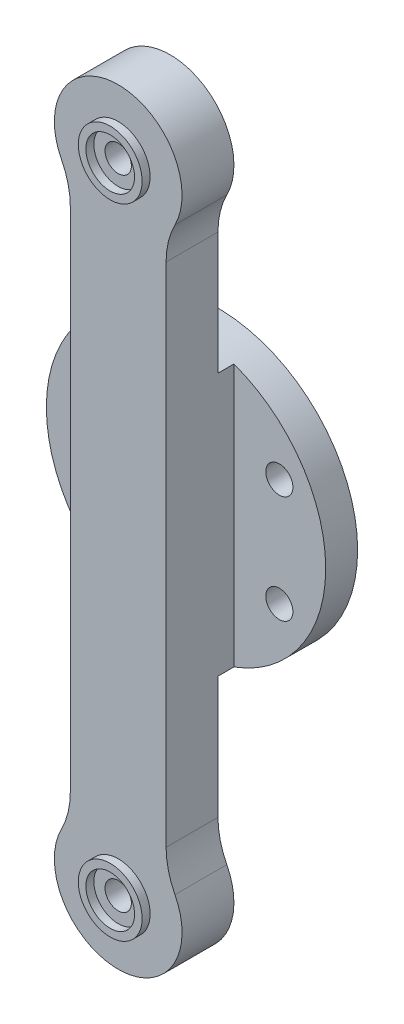
ISO-10303-21;
HEADER;
FILE_DESCRIPTION(('STEP AP214'),'2;1');
FILE_NAME('part.step','',(''),(''),'','','');
FILE_SCHEMA(('AUTOMOTIVE_DESIGN { 1 0 10303 214 1 1 1 1 }'));
ENDSEC;
DATA;
#1=APPLICATION_CONTEXT('core data for automotive mechanical design processes');
#2=APPLICATION_PROTOCOL_DEFINITION('international standard','automotive_design',2000,#1);
#3=PRODUCT_CONTEXT('',#1,'mechanical');
#4=PRODUCT('Part','Part','',(#3));
#5=PRODUCT_RELATED_PRODUCT_CATEGORY('part','',(#4));
#6=PRODUCT_DEFINITION_FORMATION('','',#4);
#7=PRODUCT_DEFINITION_CONTEXT('part definition',#1,'design');
#8=PRODUCT_DEFINITION('design','',#6,#7);
#9=PRODUCT_DEFINITION_SHAPE('','',#8);
#10=(LENGTH_UNIT() NAMED_UNIT(*) SI_UNIT(.MILLI.,.METRE.));
#11=(NAMED_UNIT(*) PLANE_ANGLE_UNIT() SI_UNIT($,.RADIAN.));
#12=(NAMED_UNIT(*) SI_UNIT($,.STERADIAN.) SOLID_ANGLE_UNIT());
#13=UNCERTAINTY_MEASURE_WITH_UNIT(LENGTH_MEASURE(1.E-05),#10,'distance_accuracy_value','');
#14=(GEOMETRIC_REPRESENTATION_CONTEXT(3) GLOBAL_UNCERTAINTY_ASSIGNED_CONTEXT((#13)) GLOBAL_UNIT_ASSIGNED_CONTEXT((#10,
#11,#12)) REPRESENTATION_CONTEXT('',''));
#15=CARTESIAN_POINT('',(0.,0.,0.));
#16=DIRECTION('',(0.,0.,1.));
#17=DIRECTION('',(1.,0.,0.));
#18=AXIS2_PLACEMENT_3D('',#15,#16,#17);
#19=CARTESIAN_POINT('',(0.,0.,0.));
#20=DIRECTION('',(0.,0.,1.));
#21=DIRECTION('',(1.,0.,0.));
#22=AXIS2_PLACEMENT_3D('',#19,#20,#21);
#23=PLANE('',#22);
#24=CARTESIAN_POINT('',(11.6913429510888,-6.75000000000067,0.));
#25=DIRECTION('',(0.,0.,1.));
#26=DIRECTION('',(1.,0.,0.));
#27=AXIS2_PLACEMENT_3D('',#24,#25,#26);
#28=CIRCLE('',#27,1.70000000000019);
#29=CARTESIAN_POINT('',(13.391342951089,-6.75000000000067,0.));
#30=VERTEX_POINT('',#29);
#31=EDGE_CURVE('E311',#30,#30,#28,.T.);
#32=ORIENTED_EDGE('',*,*,#31,.F.);
#33=EDGE_LOOP('',(#32));
#34=FACE_BOUND('',#33,.T.);
#35=CARTESIAN_POINT('',(11.6913429510895,6.74999999999933,0.));
#36=DIRECTION('',(0.,0.,1.));
#37=DIRECTION('',(1.,0.,0.));
#38=AXIS2_PLACEMENT_3D('',#35,#36,#37);
#39=CIRCLE('',#38,1.70000000000019);
#40=CARTESIAN_POINT('',(13.3913429510897,6.74999999999933,0.));
#41=VERTEX_POINT('',#40);
#42=EDGE_CURVE('E322',#41,#41,#39,.T.);
#43=ORIENTED_EDGE('',*,*,#42,.F.);
#44=EDGE_LOOP('',(#43));
#45=FACE_BOUND('',#44,.T.);
#46=DIRECTION('',(0.,1.,0.));
#47=VECTOR('',#46,1.);
#48=CARTESIAN_POINT('',(6.,16.4392822227736,0.));
#49=LINE('',#48,#47);
#50=CARTESIAN_POINT('',(6.,-16.4392822227736,0.));
#51=VERTEX_POINT('',#50);
#52=CARTESIAN_POINT('',(6.,16.4392822227736,0.));
#53=VERTEX_POINT('',#52);
#54=EDGE_CURVE('E162',#51,#53,#49,.T.);
#55=ORIENTED_EDGE('',*,*,#54,.F.);
#56=CARTESIAN_POINT('',(0.,0.,0.));
#57=DIRECTION('',(0.,0.,1.));
#58=DIRECTION('',(1.,0.,0.));
#59=AXIS2_PLACEMENT_3D('',#56,#57,#58);
#60=CIRCLE('',#59,17.5);
#61=EDGE_CURVE('E151',#51,#53,#60,.T.);
#62=ORIENTED_EDGE('',*,*,#61,.T.);
#63=EDGE_LOOP('',(#55,#62));
#64=FACE_BOUND('',#63,.T.);
#65=ADVANCED_FACE('F41',(#34,#45,#64),#23,.T.);
#66=CARTESIAN_POINT('',(0.,0.,-4.));
#67=DIRECTION('',(0.,0.,1.));
#68=DIRECTION('',(1.,0.,0.));
#69=AXIS2_PLACEMENT_3D('',#66,#67,#68);
#70=CYLINDRICAL_SURFACE('',#69,17.5);
#71=CARTESIAN_POINT('',(0.,0.,-4.));
#72=DIRECTION('',(0.,0.,1.));
#73=DIRECTION('',(1.,0.,0.));
#74=AXIS2_PLACEMENT_3D('',#71,#72,#73);
#75=CIRCLE('',#74,17.5);
#76=CARTESIAN_POINT('',(17.5,0.,-4.));
#77=VERTEX_POINT('',#76);
#78=EDGE_CURVE('E177',#77,#77,#75,.T.);
#79=ORIENTED_EDGE('',*,*,#78,.T.);
#80=EDGE_LOOP('',(#79));
#81=FACE_BOUND('',#80,.T.);
#82=CARTESIAN_POINT('',(-6.,16.4392822227736,0.));
#83=VERTEX_POINT('',#82);
#84=CARTESIAN_POINT('',(-6.,-16.4392822227736,0.));
#85=VERTEX_POINT('',#84);
#86=EDGE_CURVE('E176',#83,#85,#60,.T.);
#87=ORIENTED_EDGE('',*,*,#86,.F.);
#88=DIRECTION('',(0.,0.,-1.));
#89=VECTOR('',#88,1.);
#90=CARTESIAN_POINT('',(-6.,16.4392822227736,2.));
#91=LINE('',#90,#89);
#92=CARTESIAN_POINT('',(-6.,16.4392822227736,2.));
#93=VERTEX_POINT('',#92);
#94=EDGE_CURVE('E172',#93,#83,#91,.T.);
#95=ORIENTED_EDGE('',*,*,#94,.F.);
#96=CARTESIAN_POINT('',(0.,0.,2.));
#97=DIRECTION('',(0.,0.,1.));
#98=DIRECTION('',(-1.,0.,0.));
#99=AXIS2_PLACEMENT_3D('',#96,#97,#98);
#100=CIRCLE('',#99,17.5);
#101=CARTESIAN_POINT('',(6.,16.4392822227736,2.));
#102=VERTEX_POINT('',#101);
#103=EDGE_CURVE('E158',#102,#93,#100,.T.);
#104=ORIENTED_EDGE('',*,*,#103,.F.);
#105=DIRECTION('',(0.,0.,-1.));
#106=VECTOR('',#105,1.);
#107=CARTESIAN_POINT('',(6.,16.4392822227736,2.));
#108=LINE('',#107,#106);
#109=EDGE_CURVE('E153',#102,#53,#108,.T.);
#110=ORIENTED_EDGE('',*,*,#109,.T.);
#111=ORIENTED_EDGE('',*,*,#61,.F.);
#112=DIRECTION('',(0.,0.,-1.));
#113=VECTOR('',#112,1.);
#114=CARTESIAN_POINT('',(6.,-16.4392822227736,2.));
#115=LINE('',#114,#113);
#116=CARTESIAN_POINT('',(6.,-16.4392822227736,2.));
#117=VERTEX_POINT('',#116);
#118=EDGE_CURVE('E135',#117,#51,#115,.T.);
#119=ORIENTED_EDGE('',*,*,#118,.F.);
#120=CARTESIAN_POINT('',(0.,0.,2.));
#121=DIRECTION('',(0.,0.,1.));
#122=DIRECTION('',(-1.,0.,0.));
#123=AXIS2_PLACEMENT_3D('',#120,#121,#122);
#124=CIRCLE('',#123,17.5);
#125=CARTESIAN_POINT('',(-6.,-16.4392822227736,2.));
#126=VERTEX_POINT('',#125);
#127=EDGE_CURVE('E148',#126,#117,#124,.T.);
#128=ORIENTED_EDGE('',*,*,#127,.F.);
#129=DIRECTION('',(0.,0.,-1.));
#130=VECTOR('',#129,1.);
#131=CARTESIAN_POINT('',(-6.,-16.4392822227736,2.));
#132=LINE('',#131,#130);
#133=EDGE_CURVE('E152',#126,#85,#132,.T.);
#134=ORIENTED_EDGE('',*,*,#133,.T.);
#135=EDGE_LOOP('',(#87,#95,#104,#110,#111,#119,#128,#134));
#136=FACE_BOUND('',#135,.T.);
#137=ADVANCED_FACE('F146',(#81,#136),#70,.T.);
#138=CARTESIAN_POINT('',(17.5,0.,-4.));
#139=DIRECTION('',(0.,0.,-1.));
#140=DIRECTION('',(-1.,0.,0.));
#141=AXIS2_PLACEMENT_3D('',#138,#139,#140);
#142=PLANE('',#141);
#143=CARTESIAN_POINT('',(-11.6913429510903,6.75000000000067,-4.));
#144=DIRECTION('',(0.,0.,-1.));
#145=DIRECTION('',(-1.,0.,0.));
#146=AXIS2_PLACEMENT_3D('',#143,#144,#145);
#147=CIRCLE('',#146,1.70000000000019);
#148=CARTESIAN_POINT('',(-13.3913429510905,6.75000000000067,-4.));
#149=VERTEX_POINT('',#148);
#150=EDGE_CURVE('E185',#149,#149,#147,.T.);
#151=ORIENTED_EDGE('',*,*,#150,.F.);
#152=EDGE_LOOP('',(#151));
#153=FACE_BOUND('',#152,.T.);
#154=CARTESIAN_POINT('',(-11.6913429510911,-6.74999999999934,-4.));
#155=DIRECTION('',(0.,0.,-1.));
#156=DIRECTION('',(-1.,0.,0.));
#157=AXIS2_PLACEMENT_3D('',#154,#155,#156);
#158=CIRCLE('',#157,1.70000000000019);
#159=CARTESIAN_POINT('',(-13.3913429510913,-6.74999999999934,-4.));
#160=VERTEX_POINT('',#159);
#161=EDGE_CURVE('E184',#160,#160,#158,.T.);
#162=ORIENTED_EDGE('',*,*,#161,.F.);
#163=EDGE_LOOP('',(#162));
#164=FACE_BOUND('',#163,.T.);
#165=CARTESIAN_POINT('',(11.6913429510888,-6.75000000000067,-4.));
#166=DIRECTION('',(0.,0.,-1.));
#167=DIRECTION('',(-1.,0.,0.));
#168=AXIS2_PLACEMENT_3D('',#165,#166,#167);
#169=CIRCLE('',#168,1.70000000000019);
#170=CARTESIAN_POINT('',(9.99134295108857,-6.75000000000067,-4.));
#171=VERTEX_POINT('',#170);
#172=EDGE_CURVE('E308',#171,#171,#169,.T.);
#173=ORIENTED_EDGE('',*,*,#172,.F.);
#174=EDGE_LOOP('',(#173));
#175=FACE_BOUND('',#174,.T.);
#176=CARTESIAN_POINT('',(11.6913429510895,6.74999999999933,-4.));
#177=DIRECTION('',(0.,0.,-1.));
#178=DIRECTION('',(-1.,0.,0.));
#179=AXIS2_PLACEMENT_3D('',#176,#177,#178);
#180=CIRCLE('',#179,1.70000000000019);
#181=CARTESIAN_POINT('',(9.99134295108935,6.74999999999933,-4.));
#182=VERTEX_POINT('',#181);
#183=EDGE_CURVE('E319',#182,#182,#180,.T.);
#184=ORIENTED_EDGE('',*,*,#183,.F.);
#185=EDGE_LOOP('',(#184));
#186=FACE_BOUND('',#185,.T.);
#187=ORIENTED_EDGE('',*,*,#78,.F.);
#188=EDGE_LOOP('',(#187));
#189=FACE_BOUND('',#188,.T.);
#190=ADVANCED_FACE('F286',(#153,#164,#175,#186,#189),#142,.T.);
#191=CARTESIAN_POINT('',(-11.6913429510903,6.75000000000067,0.));
#192=DIRECTION('',(0.,0.,1.));
#193=DIRECTION('',(1.,0.,0.));
#194=AXIS2_PLACEMENT_3D('',#191,#192,#193);
#195=CIRCLE('',#194,1.70000000000019);
#196=CARTESIAN_POINT('',(-9.99134295109011,6.75000000000067,0.));
#197=VERTEX_POINT('',#196);
#198=EDGE_CURVE('E181',#197,#197,#195,.T.);
#199=ORIENTED_EDGE('',*,*,#198,.F.);
#200=EDGE_LOOP('',(#199));
#201=FACE_BOUND('',#200,.T.);
#202=CARTESIAN_POINT('',(-11.6913429510911,-6.74999999999934,0.));
#203=DIRECTION('',(0.,0.,1.));
#204=DIRECTION('',(1.,0.,0.));
#205=AXIS2_PLACEMENT_3D('',#202,#203,#204);
#206=CIRCLE('',#205,1.70000000000019);
#207=CARTESIAN_POINT('',(-9.99134295109087,-6.74999999999934,0.));
#208=VERTEX_POINT('',#207);
#209=EDGE_CURVE('E305',#208,#208,#206,.T.);
#210=ORIENTED_EDGE('',*,*,#209,.F.);
#211=EDGE_LOOP('',(#210));
#212=FACE_BOUND('',#211,.T.);
#213=DIRECTION('',(0.,-1.,0.));
#214=VECTOR('',#213,1.);
#215=CARTESIAN_POINT('',(-6.,-16.4392822227736,0.));
#216=LINE('',#215,#214);
#217=EDGE_CURVE('E166',#83,#85,#216,.T.);
#218=ORIENTED_EDGE('',*,*,#217,.F.);
#219=ORIENTED_EDGE('',*,*,#86,.T.);
#220=EDGE_LOOP('',(#218,#219));
#221=FACE_BOUND('',#220,.T.);
#222=ADVANCED_FACE('F280',(#201,#212,#221),#23,.T.);
#223=CARTESIAN_POINT('',(-6.,-16.4392822227736,2.));
#224=DIRECTION('',(1.,0.,0.));
#225=DIRECTION('',(0.,0.,-1.));
#226=AXIS2_PLACEMENT_3D('',#223,#224,#225);
#227=PLANE('',#226);
#228=DIRECTION('',(0.,-1.,0.));
#229=VECTOR('',#228,1.);
#230=CARTESIAN_POINT('',(-6.,-34.7084973778708,2.));
#231=LINE('',#230,#229);
#232=CARTESIAN_POINT('',(-6.,-31.7537887487647,2.));
#233=VERTEX_POINT('',#232);
#234=EDGE_CURVE('E157',#126,#233,#231,.T.);
#235=ORIENTED_EDGE('',*,*,#234,.T.);
#236=DIRECTION('',(0.,0.,1.));
#237=VECTOR('',#236,1.);
#238=CARTESIAN_POINT('',(-6.,-31.7537887487647,8.5));
#239=LINE('',#238,#237);
#240=CARTESIAN_POINT('',(-6.,-31.7537887487647,8.5));
#241=VERTEX_POINT('',#240);
#242=EDGE_CURVE('E202',#233,#241,#239,.T.);
#243=ORIENTED_EDGE('',*,*,#242,.T.);
#244=DIRECTION('',(0.,-1.,0.));
#245=VECTOR('',#244,1.);
#246=CARTESIAN_POINT('',(-6.,-34.7084973778708,8.5));
#247=LINE('',#246,#245);
#248=CARTESIAN_POINT('',(-6.,31.7537887487647,8.5));
#249=VERTEX_POINT('',#248);
#250=EDGE_CURVE('E169',#249,#241,#247,.T.);
#251=ORIENTED_EDGE('',*,*,#250,.F.);
#252=DIRECTION('',(0.,0.,1.));
#253=VECTOR('',#252,1.);
#254=CARTESIAN_POINT('',(-6.,31.7537887487647,2.));
#255=LINE('',#254,#253);
#256=CARTESIAN_POINT('',(-6.,31.7537887487647,2.));
#257=VERTEX_POINT('',#256);
#258=EDGE_CURVE('E199',#249,#257,#255,.F.);
#259=ORIENTED_EDGE('',*,*,#258,.T.);
#260=EDGE_CURVE('E251',#257,#93,#231,.T.);
#261=ORIENTED_EDGE('',*,*,#260,.T.);
#262=ORIENTED_EDGE('',*,*,#94,.T.);
#263=ORIENTED_EDGE('',*,*,#217,.T.);
#264=ORIENTED_EDGE('',*,*,#133,.F.);
#265=EDGE_LOOP('',(#235,#243,#251,#259,#261,#262,#263,#264));
#266=FACE_BOUND('',#265,.T.);
#267=ADVANCED_FACE('F257',(#266),#227,.F.);
#268=CARTESIAN_POINT('',(6.,16.4392822227736,2.));
#269=DIRECTION('',(-1.,0.,0.));
#270=DIRECTION('',(0.,0.,1.));
#271=AXIS2_PLACEMENT_3D('',#268,#269,#270);
#272=PLANE('',#271);
#273=DIRECTION('',(0.,1.,0.));
#274=VECTOR('',#273,1.);
#275=CARTESIAN_POINT('',(6.,34.7084973778708,8.5));
#276=LINE('',#275,#274);
#277=CARTESIAN_POINT('',(6.,-31.7537887487647,8.5));
#278=VERTEX_POINT('',#277);
#279=CARTESIAN_POINT('',(6.,31.7537887487647,8.5));
#280=VERTEX_POINT('',#279);
#281=EDGE_CURVE('E238',#278,#280,#276,.T.);
#282=ORIENTED_EDGE('',*,*,#281,.F.);
#283=DIRECTION('',(0.,0.,1.));
#284=VECTOR('',#283,1.);
#285=CARTESIAN_POINT('',(6.,-31.7537887487647,2.));
#286=LINE('',#285,#284);
#287=CARTESIAN_POINT('',(6.,-31.7537887487647,2.));
#288=VERTEX_POINT('',#287);
#289=EDGE_CURVE('E136',#278,#288,#286,.F.);
#290=ORIENTED_EDGE('',*,*,#289,.T.);
#291=DIRECTION('',(0.,1.,0.));
#292=VECTOR('',#291,1.);
#293=CARTESIAN_POINT('',(6.,34.7084973778708,2.));
#294=LINE('',#293,#292);
#295=EDGE_CURVE('E131',#288,#117,#294,.T.);
#296=ORIENTED_EDGE('',*,*,#295,.T.);
#297=ORIENTED_EDGE('',*,*,#118,.T.);
#298=ORIENTED_EDGE('',*,*,#54,.T.);
#299=ORIENTED_EDGE('',*,*,#109,.F.);
#300=CARTESIAN_POINT('',(6.,31.7537887487647,2.));
#301=VERTEX_POINT('',#300);
#302=EDGE_CURVE('E140',#102,#301,#294,.T.);
#303=ORIENTED_EDGE('',*,*,#302,.T.);
#304=DIRECTION('',(0.,0.,1.));
#305=VECTOR('',#304,1.);
#306=CARTESIAN_POINT('',(6.,31.7537887487647,8.5));
#307=LINE('',#306,#305);
#308=EDGE_CURVE('E64',#301,#280,#307,.T.);
#309=ORIENTED_EDGE('',*,*,#308,.T.);
#310=EDGE_LOOP('',(#282,#290,#296,#297,#298,#299,#303,#309));
#311=FACE_BOUND('',#310,.T.);
#312=ADVANCED_FACE('F133',(#311),#272,.F.);
#313=CARTESIAN_POINT('',(0.,-40.,2.));
#314=DIRECTION('',(0.,0.,-1.));
#315=DIRECTION('',(-1.,0.,0.));
#316=AXIS2_PLACEMENT_3D('',#313,#314,#315);
#317=PLANE('',#316);
#318=CARTESIAN_POINT('',(0.,40.,2.));
#319=DIRECTION('',(0.,0.,-1.));
#320=DIRECTION('',(-1.,0.,0.));
#321=AXIS2_PLACEMENT_3D('',#318,#319,#320);
#322=CIRCLE('',#321,1.65000000000001);
#323=CARTESIAN_POINT('',(-1.65000000000001,40.,2.));
#324=VERTEX_POINT('',#323);
#325=EDGE_CURVE('E186',#324,#324,#322,.T.);
#326=ORIENTED_EDGE('',*,*,#325,.F.);
#327=EDGE_LOOP('',(#326));
#328=FACE_BOUND('',#327,.T.);
#329=ORIENTED_EDGE('',*,*,#302,.F.);
#330=ORIENTED_EDGE('',*,*,#103,.T.);
#331=ORIENTED_EDGE('',*,*,#260,.F.);
#332=CARTESIAN_POINT('',(-16.,31.7537887487647,2.));
#333=DIRECTION('',(0.,0.,-1.));
#334=DIRECTION('',(-1.,0.,0.));
#335=AXIS2_PLACEMENT_3D('',#332,#333,#334);
#336=CIRCLE('',#335,10.);
#337=CARTESIAN_POINT('',(-7.11111111111111,36.3350172216732,2.));
#338=VERTEX_POINT('',#337);
#339=EDGE_CURVE('E215',#257,#338,#336,.F.);
#340=ORIENTED_EDGE('',*,*,#339,.T.);
#341=CARTESIAN_POINT('',(0.,40.,2.));
#342=DIRECTION('',(0.,0.,1.));
#343=DIRECTION('',(-1.,0.,0.));
#344=AXIS2_PLACEMENT_3D('',#341,#342,#343);
#345=CIRCLE('',#344,8.);
#346=CARTESIAN_POINT('',(7.11111111111111,36.3350172216732,2.));
#347=VERTEX_POINT('',#346);
#348=EDGE_CURVE('E139',#347,#338,#345,.T.);
#349=ORIENTED_EDGE('',*,*,#348,.F.);
#350=CARTESIAN_POINT('',(16.,31.7537887487647,2.));
#351=DIRECTION('',(0.,0.,-1.));
#352=DIRECTION('',(-1.,0.,0.));
#353=AXIS2_PLACEMENT_3D('',#350,#351,#352);
#354=CIRCLE('',#353,10.);
#355=EDGE_CURVE('E49',#347,#301,#354,.F.);
#356=ORIENTED_EDGE('',*,*,#355,.T.);
#357=EDGE_LOOP('',(#329,#330,#331,#340,#349,#356));
#358=FACE_BOUND('',#357,.T.);
#359=ADVANCED_FACE('F224',(#328,#358),#317,.T.);
#360=CARTESIAN_POINT('',(0.,-40.,8.5));
#361=DIRECTION('',(0.,0.,-1.));
#362=DIRECTION('',(-1.,0.,0.));
#363=AXIS2_PLACEMENT_3D('',#360,#361,#362);
#364=CYLINDRICAL_SURFACE('',#363,8.);
#365=CARTESIAN_POINT('',(0.,-40.,8.5));
#366=DIRECTION('',(0.,0.,1.));
#367=DIRECTION('',(-1.,0.,0.));
#368=AXIS2_PLACEMENT_3D('',#365,#366,#367);
#369=CIRCLE('',#368,8.);
#370=CARTESIAN_POINT('',(-7.11111111111111,-36.3350172216732,8.5));
#371=VERTEX_POINT('',#370);
#372=CARTESIAN_POINT('',(7.11111111111111,-36.3350172216732,8.5));
#373=VERTEX_POINT('',#372);
#374=EDGE_CURVE('E244',#371,#373,#369,.T.);
#375=ORIENTED_EDGE('',*,*,#374,.F.);
#376=DIRECTION('',(0.,0.,-1.));
#377=VECTOR('',#376,1.);
#378=CARTESIAN_POINT('',(-7.11111111111111,-36.3350172216732,8.5));
#379=LINE('',#378,#377);
#380=CARTESIAN_POINT('',(-7.11111111111111,-36.3350172216732,2.));
#381=VERTEX_POINT('',#380);
#382=EDGE_CURVE('E196',#371,#381,#379,.T.);
#383=ORIENTED_EDGE('',*,*,#382,.T.);
#384=CARTESIAN_POINT('',(0.,-40.,2.));
#385=DIRECTION('',(0.,0.,1.));
#386=DIRECTION('',(-1.,0.,0.));
#387=AXIS2_PLACEMENT_3D('',#384,#385,#386);
#388=CIRCLE('',#387,8.);
#389=CARTESIAN_POINT('',(7.11111111111111,-36.3350172216732,2.));
#390=VERTEX_POINT('',#389);
#391=EDGE_CURVE('E229',#381,#390,#388,.T.);
#392=ORIENTED_EDGE('',*,*,#391,.T.);
#393=DIRECTION('',(0.,0.,-1.));
#394=VECTOR('',#393,1.);
#395=CARTESIAN_POINT('',(7.11111111111111,-36.3350172216732,8.5));
#396=LINE('',#395,#394);
#397=EDGE_CURVE('E180',#390,#373,#396,.F.);
#398=ORIENTED_EDGE('',*,*,#397,.T.);
#399=EDGE_LOOP('',(#375,#383,#392,#398));
#400=FACE_BOUND('',#399,.T.);
#401=ADVANCED_FACE('F266',(#400),#364,.T.);
#402=CARTESIAN_POINT('',(0.,40.,8.5));
#403=DIRECTION('',(0.,0.,-1.));
#404=DIRECTION('',(-1.,0.,0.));
#405=AXIS2_PLACEMENT_3D('',#402,#403,#404);
#406=CYLINDRICAL_SURFACE('',#405,8.);
#407=ORIENTED_EDGE('',*,*,#348,.T.);
#408=DIRECTION('',(0.,0.,-1.));
#409=VECTOR('',#408,1.);
#410=CARTESIAN_POINT('',(-7.11111111111111,36.3350172216732,8.5));
#411=LINE('',#410,#409);
#412=CARTESIAN_POINT('',(-7.11111111111111,36.3350172216732,8.5));
#413=VERTEX_POINT('',#412);
#414=EDGE_CURVE('E207',#338,#413,#411,.F.);
#415=ORIENTED_EDGE('',*,*,#414,.T.);
#416=CARTESIAN_POINT('',(0.,40.,8.5));
#417=DIRECTION('',(0.,0.,1.));
#418=DIRECTION('',(-1.,0.,0.));
#419=AXIS2_PLACEMENT_3D('',#416,#417,#418);
#420=CIRCLE('',#419,8.);
#421=CARTESIAN_POINT('',(7.11111111111111,36.3350172216732,8.5));
#422=VERTEX_POINT('',#421);
#423=EDGE_CURVE('E236',#422,#413,#420,.T.);
#424=ORIENTED_EDGE('',*,*,#423,.F.);
#425=DIRECTION('',(0.,0.,-1.));
#426=VECTOR('',#425,1.);
#427=CARTESIAN_POINT('',(7.11111111111111,36.3350172216732,8.5));
#428=LINE('',#427,#426);
#429=EDGE_CURVE('E204',#422,#347,#428,.T.);
#430=ORIENTED_EDGE('',*,*,#429,.T.);
#431=EDGE_LOOP('',(#407,#415,#424,#430));
#432=FACE_BOUND('',#431,.T.);
#433=ADVANCED_FACE('F240',(#432),#406,.T.);
#434=CARTESIAN_POINT('',(0.,-40.,8.5));
#435=DIRECTION('',(0.,0.,-1.));
#436=DIRECTION('',(-1.,0.,0.));
#437=AXIS2_PLACEMENT_3D('',#434,#435,#436);
#438=PLANE('',#437);
#439=CARTESIAN_POINT('',(0.,40.,8.5));
#440=DIRECTION('',(0.,0.,-1.));
#441=DIRECTION('',(-1.,0.,0.));
#442=AXIS2_PLACEMENT_3D('',#439,#440,#441);
#443=CIRCLE('',#442,4.);
#444=CARTESIAN_POINT('',(-4.,40.,8.5));
#445=VERTEX_POINT('',#444);
#446=EDGE_CURVE('E325',#445,#445,#443,.T.);
#447=ORIENTED_EDGE('',*,*,#446,.T.);
#448=EDGE_LOOP('',(#447));
#449=FACE_BOUND('',#448,.T.);
#450=CARTESIAN_POINT('',(0.,-40.,8.5));
#451=DIRECTION('',(0.,0.,-1.));
#452=DIRECTION('',(-1.,0.,0.));
#453=AXIS2_PLACEMENT_3D('',#450,#451,#452);
#454=CIRCLE('',#453,4.);
#455=CARTESIAN_POINT('',(-4.,-40.,8.5));
#456=VERTEX_POINT('',#455);
#457=EDGE_CURVE('E331',#456,#456,#454,.T.);
#458=ORIENTED_EDGE('',*,*,#457,.T.);
#459=EDGE_LOOP('',(#458));
#460=FACE_BOUND('',#459,.T.);
#461=ORIENTED_EDGE('',*,*,#250,.T.);
#462=CARTESIAN_POINT('',(-16.,-31.7537887487647,8.5));
#463=DIRECTION('',(0.,0.,-1.));
#464=DIRECTION('',(-1.,0.,0.));
#465=AXIS2_PLACEMENT_3D('',#462,#463,#464);
#466=CIRCLE('',#465,10.);
#467=EDGE_CURVE('E213',#241,#371,#466,.T.);
#468=ORIENTED_EDGE('',*,*,#467,.T.);
#469=ORIENTED_EDGE('',*,*,#374,.T.);
#470=CARTESIAN_POINT('',(16.,-31.7537887487647,8.5));
#471=DIRECTION('',(0.,0.,-1.));
#472=DIRECTION('',(-1.,0.,0.));
#473=AXIS2_PLACEMENT_3D('',#470,#471,#472);
#474=CIRCLE('',#473,10.);
#475=EDGE_CURVE('E220',#373,#278,#474,.T.);
#476=ORIENTED_EDGE('',*,*,#475,.T.);
#477=ORIENTED_EDGE('',*,*,#281,.T.);
#478=CARTESIAN_POINT('',(16.,31.7537887487647,8.5));
#479=DIRECTION('',(0.,0.,-1.));
#480=DIRECTION('',(-1.,0.,0.));
#481=AXIS2_PLACEMENT_3D('',#478,#479,#480);
#482=CIRCLE('',#481,10.);
#483=EDGE_CURVE('E11',#280,#422,#482,.T.);
#484=ORIENTED_EDGE('',*,*,#483,.T.);
#485=ORIENTED_EDGE('',*,*,#423,.T.);
#486=CARTESIAN_POINT('',(-16.,31.7537887487647,8.5));
#487=DIRECTION('',(0.,0.,-1.));
#488=DIRECTION('',(-1.,0.,0.));
#489=AXIS2_PLACEMENT_3D('',#486,#487,#488);
#490=CIRCLE('',#489,10.);
#491=EDGE_CURVE('E217',#413,#249,#490,.T.);
#492=ORIENTED_EDGE('',*,*,#491,.T.);
#493=EDGE_LOOP('',(#461,#468,#469,#476,#477,#484,#485,#492));
#494=FACE_BOUND('',#493,.T.);
#495=ADVANCED_FACE('F235',(#449,#460,#494),#438,.F.);
#496=CARTESIAN_POINT('',(0.,-40.,2.));
#497=DIRECTION('',(0.,0.,-1.));
#498=DIRECTION('',(-1.,0.,0.));
#499=AXIS2_PLACEMENT_3D('',#496,#497,#498);
#500=CIRCLE('',#499,1.65000000000001);
#501=CARTESIAN_POINT('',(-1.65000000000001,-40.,2.));
#502=VERTEX_POINT('',#501);
#503=EDGE_CURVE('E190',#502,#502,#500,.T.);
#504=ORIENTED_EDGE('',*,*,#503,.F.);
#505=EDGE_LOOP('',(#504));
#506=FACE_BOUND('',#505,.T.);
#507=ORIENTED_EDGE('',*,*,#234,.F.);
#508=ORIENTED_EDGE('',*,*,#127,.T.);
#509=ORIENTED_EDGE('',*,*,#295,.F.);
#510=CARTESIAN_POINT('',(16.,-31.7537887487647,2.));
#511=DIRECTION('',(0.,0.,-1.));
#512=DIRECTION('',(-1.,0.,0.));
#513=AXIS2_PLACEMENT_3D('',#510,#511,#512);
#514=CIRCLE('',#513,10.);
#515=EDGE_CURVE('E56',#288,#390,#514,.F.);
#516=ORIENTED_EDGE('',*,*,#515,.T.);
#517=ORIENTED_EDGE('',*,*,#391,.F.);
#518=CARTESIAN_POINT('',(-16.,-31.7537887487647,2.));
#519=DIRECTION('',(0.,0.,-1.));
#520=DIRECTION('',(-1.,0.,0.));
#521=AXIS2_PLACEMENT_3D('',#518,#519,#520);
#522=CIRCLE('',#521,10.);
#523=EDGE_CURVE('E211',#381,#233,#522,.F.);
#524=ORIENTED_EDGE('',*,*,#523,.T.);
#525=EDGE_LOOP('',(#507,#508,#509,#516,#517,#524));
#526=FACE_BOUND('',#525,.T.);
#527=ADVANCED_FACE('F155',(#506,#526),#317,.T.);
#528=CARTESIAN_POINT('',(0.,-40.,9.5));
#529=DIRECTION('',(0.,0.,-1.));
#530=DIRECTION('',(-1.,0.,0.));
#531=AXIS2_PLACEMENT_3D('',#528,#529,#530);
#532=CYLINDRICAL_SURFACE('',#531,4.);
#533=CARTESIAN_POINT('',(0.,-40.,9.5));
#534=DIRECTION('',(0.,0.,-1.));
#535=DIRECTION('',(-1.,0.,0.));
#536=AXIS2_PLACEMENT_3D('',#533,#534,#535);
#537=CIRCLE('',#536,4.);
#538=CARTESIAN_POINT('',(-4.,-40.,9.5));
#539=VERTEX_POINT('',#538);
#540=EDGE_CURVE('E249',#539,#539,#537,.T.);
#541=ORIENTED_EDGE('',*,*,#540,.T.);
#542=EDGE_LOOP('',(#541));
#543=FACE_BOUND('',#542,.T.);
#544=ORIENTED_EDGE('',*,*,#457,.F.);
#545=EDGE_LOOP('',(#544));
#546=FACE_BOUND('',#545,.T.);
#547=ADVANCED_FACE('F337',(#543,#546),#532,.T.);
#548=CARTESIAN_POINT('',(4.,-40.,9.5));
#549=DIRECTION('',(0.,0.,1.));
#550=DIRECTION('',(1.,0.,0.));
#551=AXIS2_PLACEMENT_3D('',#548,#549,#550);
#552=PLANE('',#551);
#553=CARTESIAN_POINT('',(0.,-40.,9.5));
#554=DIRECTION('',(0.,0.,1.));
#555=DIRECTION('',(1.,0.,0.));
#556=AXIS2_PLACEMENT_3D('',#553,#554,#555);
#557=CIRCLE('',#556,3.04999999999999);
#558=CARTESIAN_POINT('',(3.04999999999999,-40.,9.5));
#559=VERTEX_POINT('',#558);
#560=EDGE_CURVE('E444',#559,#559,#557,.T.);
#561=ORIENTED_EDGE('',*,*,#560,.F.);
#562=EDGE_LOOP('',(#561));
#563=FACE_BOUND('',#562,.T.);
#564=ORIENTED_EDGE('',*,*,#540,.F.);
#565=EDGE_LOOP('',(#564));
#566=FACE_BOUND('',#565,.T.);
#567=ADVANCED_FACE('F340',(#563,#566),#552,.T.);
#568=CARTESIAN_POINT('',(0.,40.,9.5));
#569=DIRECTION('',(0.,0.,-1.));
#570=DIRECTION('',(-1.,0.,0.));
#571=AXIS2_PLACEMENT_3D('',#568,#569,#570);
#572=CYLINDRICAL_SURFACE('',#571,4.);
#573=CARTESIAN_POINT('',(0.,40.,9.5));
#574=DIRECTION('',(0.,0.,-1.));
#575=DIRECTION('',(-1.,0.,0.));
#576=AXIS2_PLACEMENT_3D('',#573,#574,#575);
#577=CIRCLE('',#576,4.);
#578=CARTESIAN_POINT('',(-4.,40.,9.5));
#579=VERTEX_POINT('',#578);
#580=EDGE_CURVE('E328',#579,#579,#577,.T.);
#581=ORIENTED_EDGE('',*,*,#580,.T.);
#582=EDGE_LOOP('',(#581));
#583=FACE_BOUND('',#582,.T.);
#584=ORIENTED_EDGE('',*,*,#446,.F.);
#585=EDGE_LOOP('',(#584));
#586=FACE_BOUND('',#585,.T.);
#587=ADVANCED_FACE('F342',(#583,#586),#572,.T.);
#588=CARTESIAN_POINT('',(4.,40.,9.5));
#589=DIRECTION('',(0.,0.,1.));
#590=DIRECTION('',(1.,0.,0.));
#591=AXIS2_PLACEMENT_3D('',#588,#589,#590);
#592=PLANE('',#591);
#593=CARTESIAN_POINT('',(0.,40.,9.5));
#594=DIRECTION('',(0.,0.,1.));
#595=DIRECTION('',(1.,0.,0.));
#596=AXIS2_PLACEMENT_3D('',#593,#594,#595);
#597=CIRCLE('',#596,3.04999999999999);
#598=CARTESIAN_POINT('',(3.04999999999999,40.,9.5));
#599=VERTEX_POINT('',#598);
#600=EDGE_CURVE('E193',#599,#599,#597,.T.);
#601=ORIENTED_EDGE('',*,*,#600,.F.);
#602=EDGE_LOOP('',(#601));
#603=FACE_BOUND('',#602,.T.);
#604=ORIENTED_EDGE('',*,*,#580,.F.);
#605=EDGE_LOOP('',(#604));
#606=FACE_BOUND('',#605,.T.);
#607=ADVANCED_FACE('F349',(#603,#606),#592,.T.);
#608=CARTESIAN_POINT('',(11.6913429510895,6.74999999999933,-4.));
#609=DIRECTION('',(0.,0.,-1.));
#610=DIRECTION('',(-1.,0.,0.));
#611=AXIS2_PLACEMENT_3D('',#608,#609,#610);
#612=CYLINDRICAL_SURFACE('',#611,1.70000000000019);
#613=ORIENTED_EDGE('',*,*,#42,.T.);
#614=EDGE_LOOP('',(#613));
#615=FACE_BOUND('',#614,.T.);
#616=ORIENTED_EDGE('',*,*,#183,.T.);
#617=EDGE_LOOP('',(#616));
#618=FACE_BOUND('',#617,.T.);
#619=ADVANCED_FACE('F402',(#615,#618),#612,.F.);
#620=CARTESIAN_POINT('',(11.6913429510888,-6.75000000000067,-4.));
#621=DIRECTION('',(0.,0.,-1.));
#622=DIRECTION('',(-1.,0.,0.));
#623=AXIS2_PLACEMENT_3D('',#620,#621,#622);
#624=CYLINDRICAL_SURFACE('',#623,1.70000000000019);
#625=ORIENTED_EDGE('',*,*,#31,.T.);
#626=EDGE_LOOP('',(#625));
#627=FACE_BOUND('',#626,.T.);
#628=ORIENTED_EDGE('',*,*,#172,.T.);
#629=EDGE_LOOP('',(#628));
#630=FACE_BOUND('',#629,.T.);
#631=ADVANCED_FACE('F403',(#627,#630),#624,.F.);
#632=CARTESIAN_POINT('',(-11.6913429510911,-6.74999999999934,-4.));
#633=DIRECTION('',(0.,0.,-1.));
#634=DIRECTION('',(-1.,0.,0.));
#635=AXIS2_PLACEMENT_3D('',#632,#633,#634);
#636=CYLINDRICAL_SURFACE('',#635,1.70000000000019);
#637=ORIENTED_EDGE('',*,*,#209,.T.);
#638=EDGE_LOOP('',(#637));
#639=FACE_BOUND('',#638,.T.);
#640=ORIENTED_EDGE('',*,*,#161,.T.);
#641=EDGE_LOOP('',(#640));
#642=FACE_BOUND('',#641,.T.);
#643=ADVANCED_FACE('F409',(#639,#642),#636,.F.);
#644=CARTESIAN_POINT('',(-11.6913429510903,6.75000000000067,-4.));
#645=DIRECTION('',(0.,0.,-1.));
#646=DIRECTION('',(-1.,0.,0.));
#647=AXIS2_PLACEMENT_3D('',#644,#645,#646);
#648=CYLINDRICAL_SURFACE('',#647,1.70000000000019);
#649=ORIENTED_EDGE('',*,*,#198,.T.);
#650=EDGE_LOOP('',(#649));
#651=FACE_BOUND('',#650,.T.);
#652=ORIENTED_EDGE('',*,*,#150,.T.);
#653=EDGE_LOOP('',(#652));
#654=FACE_BOUND('',#653,.T.);
#655=ADVANCED_FACE('F380',(#651,#654),#648,.F.);
#656=CARTESIAN_POINT('',(0.,40.,9.5));
#657=DIRECTION('',(0.,0.,1.));
#658=DIRECTION('',(1.,0.,0.));
#659=AXIS2_PLACEMENT_3D('',#656,#657,#658);
#660=CYLINDRICAL_SURFACE('',#659,1.65000000000001);
#661=ORIENTED_EDGE('',*,*,#325,.T.);
#662=EDGE_LOOP('',(#661));
#663=FACE_BOUND('',#662,.T.);
#664=CARTESIAN_POINT('',(0.,40.,8.5));
#665=DIRECTION('',(0.,0.,1.));
#666=DIRECTION('',(1.,0.,0.));
#667=AXIS2_PLACEMENT_3D('',#664,#665,#666);
#668=CIRCLE('',#667,1.65000000000001);
#669=CARTESIAN_POINT('',(1.65000000000001,40.,8.5));
#670=VERTEX_POINT('',#669);
#671=EDGE_CURVE('E189',#670,#670,#668,.T.);
#672=ORIENTED_EDGE('',*,*,#671,.T.);
#673=EDGE_LOOP('',(#672));
#674=FACE_BOUND('',#673,.T.);
#675=ADVANCED_FACE('F376',(#663,#674),#660,.F.);
#676=CARTESIAN_POINT('',(1.65000000000001,40.,8.5));
#677=DIRECTION('',(0.,0.,-1.));
#678=DIRECTION('',(-1.,0.,0.));
#679=AXIS2_PLACEMENT_3D('',#676,#677,#678);
#680=PLANE('',#679);
#681=ORIENTED_EDGE('',*,*,#671,.F.);
#682=EDGE_LOOP('',(#681));
#683=FACE_BOUND('',#682,.T.);
#684=CARTESIAN_POINT('',(0.,40.,8.5));
#685=DIRECTION('',(0.,0.,1.));
#686=DIRECTION('',(1.,0.,0.));
#687=AXIS2_PLACEMENT_3D('',#684,#685,#686);
#688=CIRCLE('',#687,3.04999999999999);
#689=CARTESIAN_POINT('',(3.04999999999999,40.,8.5));
#690=VERTEX_POINT('',#689);
#691=EDGE_CURVE('E385',#690,#690,#688,.T.);
#692=ORIENTED_EDGE('',*,*,#691,.T.);
#693=EDGE_LOOP('',(#692));
#694=FACE_BOUND('',#693,.T.);
#695=ADVANCED_FACE('F379',(#683,#694),#680,.F.);
#696=CARTESIAN_POINT('',(0.,40.,9.5));
#697=DIRECTION('',(0.,0.,1.));
#698=DIRECTION('',(1.,0.,0.));
#699=AXIS2_PLACEMENT_3D('',#696,#697,#698);
#700=CYLINDRICAL_SURFACE('',#699,3.04999999999999);
#701=ORIENTED_EDGE('',*,*,#691,.F.);
#702=EDGE_LOOP('',(#701));
#703=FACE_BOUND('',#702,.T.);
#704=ORIENTED_EDGE('',*,*,#600,.T.);
#705=EDGE_LOOP('',(#704));
#706=FACE_BOUND('',#705,.T.);
#707=ADVANCED_FACE('F420',(#703,#706),#700,.F.);
#708=CARTESIAN_POINT('',(0.,-40.,9.5));
#709=DIRECTION('',(0.,0.,1.));
#710=DIRECTION('',(1.,0.,0.));
#711=AXIS2_PLACEMENT_3D('',#708,#709,#710);
#712=CYLINDRICAL_SURFACE('',#711,1.65000000000001);
#713=ORIENTED_EDGE('',*,*,#503,.T.);
#714=EDGE_LOOP('',(#713));
#715=FACE_BOUND('',#714,.T.);
#716=CARTESIAN_POINT('',(0.,-40.,8.5));
#717=DIRECTION('',(0.,0.,1.));
#718=DIRECTION('',(1.,0.,0.));
#719=AXIS2_PLACEMENT_3D('',#716,#717,#718);
#720=CIRCLE('',#719,1.65000000000001);
#721=CARTESIAN_POINT('',(1.65000000000001,-40.,8.5));
#722=VERTEX_POINT('',#721);
#723=EDGE_CURVE('E194',#722,#722,#720,.T.);
#724=ORIENTED_EDGE('',*,*,#723,.T.);
#725=EDGE_LOOP('',(#724));
#726=FACE_BOUND('',#725,.T.);
#727=ADVANCED_FACE('F423',(#715,#726),#712,.F.);
#728=CARTESIAN_POINT('',(1.65000000000001,-40.,8.5));
#729=DIRECTION('',(0.,0.,-1.));
#730=DIRECTION('',(-1.,0.,0.));
#731=AXIS2_PLACEMENT_3D('',#728,#729,#730);
#732=PLANE('',#731);
#733=ORIENTED_EDGE('',*,*,#723,.F.);
#734=EDGE_LOOP('',(#733));
#735=FACE_BOUND('',#734,.T.);
#736=CARTESIAN_POINT('',(0.,-40.,8.5));
#737=DIRECTION('',(0.,0.,1.));
#738=DIRECTION('',(1.,0.,0.));
#739=AXIS2_PLACEMENT_3D('',#736,#737,#738);
#740=CIRCLE('',#739,3.04999999999999);
#741=CARTESIAN_POINT('',(3.04999999999999,-40.,8.5));
#742=VERTEX_POINT('',#741);
#743=EDGE_CURVE('E442',#742,#742,#740,.T.);
#744=ORIENTED_EDGE('',*,*,#743,.T.);
#745=EDGE_LOOP('',(#744));
#746=FACE_BOUND('',#745,.T.);
#747=ADVANCED_FACE('F427',(#735,#746),#732,.F.);
#748=CARTESIAN_POINT('',(0.,-40.,9.5));
#749=DIRECTION('',(0.,0.,1.));
#750=DIRECTION('',(1.,0.,0.));
#751=AXIS2_PLACEMENT_3D('',#748,#749,#750);
#752=CYLINDRICAL_SURFACE('',#751,3.04999999999999);
#753=ORIENTED_EDGE('',*,*,#743,.F.);
#754=EDGE_LOOP('',(#753));
#755=FACE_BOUND('',#754,.T.);
#756=ORIENTED_EDGE('',*,*,#560,.T.);
#757=EDGE_LOOP('',(#756));
#758=FACE_BOUND('',#757,.T.);
#759=ADVANCED_FACE('F431',(#755,#758),#752,.F.);
#760=CARTESIAN_POINT('',(-16.,-31.7537887487647,8.5));
#761=DIRECTION('',(0.,0.,-1.));
#762=DIRECTION('',(-1.,0.,0.));
#763=AXIS2_PLACEMENT_3D('',#760,#761,#762);
#764=CYLINDRICAL_SURFACE('',#763,10.);
#765=ORIENTED_EDGE('',*,*,#467,.F.);
#766=ORIENTED_EDGE('',*,*,#242,.F.);
#767=ORIENTED_EDGE('',*,*,#523,.F.);
#768=ORIENTED_EDGE('',*,*,#382,.F.);
#769=EDGE_LOOP('',(#765,#766,#767,#768));
#770=FACE_BOUND('',#769,.T.);
#771=ADVANCED_FACE('F261',(#770),#764,.F.);
#772=CARTESIAN_POINT('',(-16.,31.7537887487647,8.5));
#773=DIRECTION('',(0.,0.,-1.));
#774=DIRECTION('',(-1.,0.,0.));
#775=AXIS2_PLACEMENT_3D('',#772,#773,#774);
#776=CYLINDRICAL_SURFACE('',#775,10.);
#777=ORIENTED_EDGE('',*,*,#491,.F.);
#778=ORIENTED_EDGE('',*,*,#414,.F.);
#779=ORIENTED_EDGE('',*,*,#339,.F.);
#780=ORIENTED_EDGE('',*,*,#258,.F.);
#781=EDGE_LOOP('',(#777,#778,#779,#780));
#782=FACE_BOUND('',#781,.T.);
#783=ADVANCED_FACE('F270',(#782),#776,.F.);
#784=CARTESIAN_POINT('',(16.,-31.7537887487647,8.5));
#785=DIRECTION('',(0.,0.,-1.));
#786=DIRECTION('',(-1.,0.,0.));
#787=AXIS2_PLACEMENT_3D('',#784,#785,#786);
#788=CYLINDRICAL_SURFACE('',#787,10.);
#789=ORIENTED_EDGE('',*,*,#475,.F.);
#790=ORIENTED_EDGE('',*,*,#397,.F.);
#791=ORIENTED_EDGE('',*,*,#515,.F.);
#792=ORIENTED_EDGE('',*,*,#289,.F.);
#793=EDGE_LOOP('',(#789,#790,#791,#792));
#794=FACE_BOUND('',#793,.T.);
#795=ADVANCED_FACE('F268',(#794),#788,.F.);
#796=CARTESIAN_POINT('',(16.,31.7537887487647,8.5));
#797=DIRECTION('',(0.,0.,-1.));
#798=DIRECTION('',(-1.,0.,0.));
#799=AXIS2_PLACEMENT_3D('',#796,#797,#798);
#800=CYLINDRICAL_SURFACE('',#799,10.);
#801=ORIENTED_EDGE('',*,*,#483,.F.);
#802=ORIENTED_EDGE('',*,*,#308,.F.);
#803=ORIENTED_EDGE('',*,*,#355,.F.);
#804=ORIENTED_EDGE('',*,*,#429,.F.);
#805=EDGE_LOOP('',(#801,#802,#803,#804));
#806=FACE_BOUND('',#805,.T.);
#807=ADVANCED_FACE('F43',(#806),#800,.F.);
#808=CLOSED_SHELL('',(#65,#137,#190,#222,#267,#312,#359,#401,#433,#495,#527,#547,#567,#587,#607,
#619,#631,#643,#655,#675,#695,#707,#727,#747,#759,#771,#783,#795,#807));
#809=MANIFOLD_SOLID_BREP('B2',#808);
#810=ADVANCED_BREP_SHAPE_REPRESENTATION('',(#18,#809),#14);
#811=SHAPE_DEFINITION_REPRESENTATION(#9,#810);
ENDSEC;
END-ISO-10303-21;
